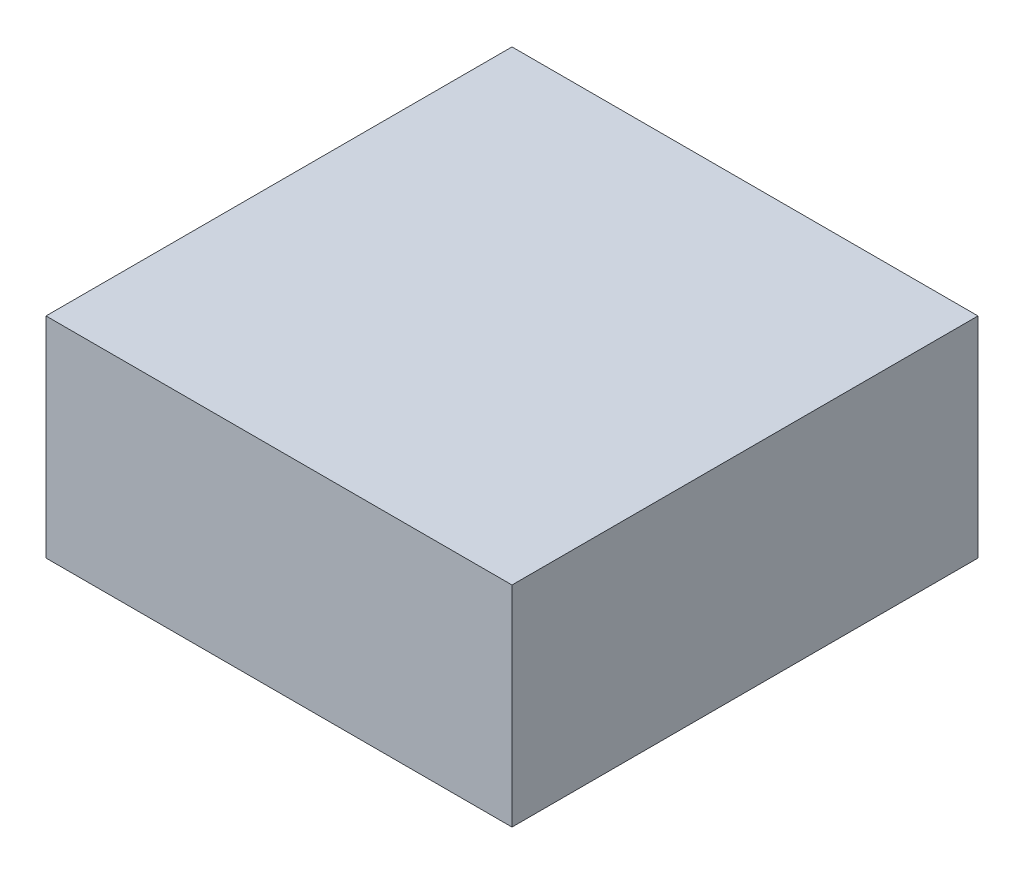
ISO-10303-21;
HEADER;
FILE_DESCRIPTION(('STEP AP214'),'2;1');
FILE_NAME('part.step','',(''),(''),'','','');
FILE_SCHEMA(('AUTOMOTIVE_DESIGN { 1 0 10303 214 1 1 1 1 }'));
ENDSEC;
DATA;
#1=APPLICATION_CONTEXT('core data for automotive mechanical design processes');
#2=APPLICATION_PROTOCOL_DEFINITION('international standard','automotive_design',2000,#1);
#3=PRODUCT_CONTEXT('',#1,'mechanical');
#4=PRODUCT('Part','Part','',(#3));
#5=PRODUCT_RELATED_PRODUCT_CATEGORY('part','',(#4));
#6=PRODUCT_DEFINITION_FORMATION('','',#4);
#7=PRODUCT_DEFINITION_CONTEXT('part definition',#1,'design');
#8=PRODUCT_DEFINITION('design','',#6,#7);
#9=PRODUCT_DEFINITION_SHAPE('','',#8);
#10=(LENGTH_UNIT() NAMED_UNIT(*) SI_UNIT(.MILLI.,.METRE.));
#11=(NAMED_UNIT(*) PLANE_ANGLE_UNIT() SI_UNIT($,.RADIAN.));
#12=(NAMED_UNIT(*) SI_UNIT($,.STERADIAN.) SOLID_ANGLE_UNIT());
#13=UNCERTAINTY_MEASURE_WITH_UNIT(LENGTH_MEASURE(1.E-05),#10,'distance_accuracy_value','');
#14=(GEOMETRIC_REPRESENTATION_CONTEXT(3) GLOBAL_UNCERTAINTY_ASSIGNED_CONTEXT((#13)) GLOBAL_UNIT_ASSIGNED_CONTEXT((#10,
#11,#12)) REPRESENTATION_CONTEXT('',''));
#15=CARTESIAN_POINT('',(0.,0.,0.));
#16=DIRECTION('',(0.,0.,1.));
#17=DIRECTION('',(1.,0.,0.));
#18=AXIS2_PLACEMENT_3D('',#15,#16,#17);
#19=CARTESIAN_POINT('',(0.,0.5,-10.));
#20=DIRECTION('',(0.,1.,0.));
#21=DIRECTION('',(1.,0.,0.));
#22=AXIS2_PLACEMENT_3D('',#19,#20,#21);
#23=PLANE('',#22);
#24=CARTESIAN_POINT('',(0.,0.5,-10.));
#25=DIRECTION('',(0.,1.,0.));
#26=DIRECTION('',(1.,0.,0.));
#27=AXIS2_PLACEMENT_3D('',#24,#25,#26);
#28=CIRCLE('',#27,5.);
#29=CARTESIAN_POINT('',(5.,0.5,-10.));
#30=VERTEX_POINT('',#29);
#31=EDGE_CURVE('E10',#30,#30,#28,.T.);
#32=ORIENTED_EDGE('',*,*,#31,.F.);
#33=EDGE_LOOP('',(#32));
#34=FACE_BOUND('',#33,.T.);
#35=ADVANCED_FACE('F15',(#34),#23,.F.);
#36=CARTESIAN_POINT('',(0.,0.5,-10.));
#37=DIRECTION('',(0.,-1.,0.));
#38=DIRECTION('',(0.,0.,-1.));
#39=AXIS2_PLACEMENT_3D('',#36,#37,#38);
#40=CYLINDRICAL_SURFACE('',#39,5.);
#41=CARTESIAN_POINT('',(0.,-4.5,-10.));
#42=DIRECTION('',(0.,1.,0.));
#43=DIRECTION('',(1.,0.,0.));
#44=AXIS2_PLACEMENT_3D('',#41,#42,#43);
#45=CIRCLE('',#44,5.);
#46=CARTESIAN_POINT('',(5.,-4.5,-10.));
#47=VERTEX_POINT('',#46);
#48=EDGE_CURVE('E104',#47,#47,#45,.T.);
#49=ORIENTED_EDGE('',*,*,#48,.F.);
#50=EDGE_LOOP('',(#49));
#51=FACE_BOUND('',#50,.T.);
#52=ORIENTED_EDGE('',*,*,#31,.T.);
#53=EDGE_LOOP('',(#52));
#54=FACE_BOUND('',#53,.T.);
#55=ADVANCED_FACE('F140',(#51,#54),#40,.F.);
#56=CARTESIAN_POINT('',(0.,0.,0.));
#57=DIRECTION('',(0.,0.,1.));
#58=DIRECTION('',(1.,0.,0.));
#59=AXIS2_PLACEMENT_3D('',#56,#57,#58);
#60=PLANE('',#59);
#61=DIRECTION('',(1.,0.,0.));
#62=VECTOR('',#61,1.);
#63=CARTESIAN_POINT('',(-10.,-4.5,0.));
#64=LINE('',#63,#62);
#65=CARTESIAN_POINT('',(-10.,-4.5,0.));
#66=VERTEX_POINT('',#65);
#67=CARTESIAN_POINT('',(10.,-4.5,0.));
#68=VERTEX_POINT('',#67);
#69=EDGE_CURVE('E97',#66,#68,#64,.T.);
#70=ORIENTED_EDGE('',*,*,#69,.T.);
#71=DIRECTION('',(0.,1.,0.));
#72=VECTOR('',#71,1.);
#73=CARTESIAN_POINT('',(10.,-4.5,0.));
#74=LINE('',#73,#72);
#75=CARTESIAN_POINT('',(10.,4.5,0.));
#76=VERTEX_POINT('',#75);
#77=EDGE_CURVE('E110',#68,#76,#74,.T.);
#78=ORIENTED_EDGE('',*,*,#77,.T.);
#79=DIRECTION('',(-1.,0.,0.));
#80=VECTOR('',#79,1.);
#81=CARTESIAN_POINT('',(10.,4.5,0.));
#82=LINE('',#81,#80);
#83=CARTESIAN_POINT('',(-10.,4.5,0.));
#84=VERTEX_POINT('',#83);
#85=EDGE_CURVE('E117',#76,#84,#82,.T.);
#86=ORIENTED_EDGE('',*,*,#85,.T.);
#87=DIRECTION('',(0.,-1.,0.));
#88=VECTOR('',#87,1.);
#89=CARTESIAN_POINT('',(-10.,4.5,0.));
#90=LINE('',#89,#88);
#91=EDGE_CURVE('E81',#84,#66,#90,.T.);
#92=ORIENTED_EDGE('',*,*,#91,.T.);
#93=EDGE_LOOP('',(#70,#78,#86,#92));
#94=FACE_BOUND('',#93,.T.);
#95=ADVANCED_FACE('F142',(#94),#60,.T.);
#96=CARTESIAN_POINT('',(0.,0.,-20.));
#97=DIRECTION('',(0.,0.,1.));
#98=DIRECTION('',(1.,0.,0.));
#99=AXIS2_PLACEMENT_3D('',#96,#97,#98);
#100=PLANE('',#99);
#101=DIRECTION('',(1.,0.,0.));
#102=VECTOR('',#101,1.);
#103=CARTESIAN_POINT('',(-10.,-4.5,-20.));
#104=LINE('',#103,#102);
#105=CARTESIAN_POINT('',(-10.,-4.5,-20.));
#106=VERTEX_POINT('',#105);
#107=CARTESIAN_POINT('',(10.,-4.5,-20.));
#108=VERTEX_POINT('',#107);
#109=EDGE_CURVE('E84',#106,#108,#104,.T.);
#110=ORIENTED_EDGE('',*,*,#109,.F.);
#111=DIRECTION('',(0.,-1.,0.));
#112=VECTOR('',#111,1.);
#113=CARTESIAN_POINT('',(-10.,4.5,-20.));
#114=LINE('',#113,#112);
#115=CARTESIAN_POINT('',(-10.,4.5,-20.));
#116=VERTEX_POINT('',#115);
#117=EDGE_CURVE('E23',#116,#106,#114,.T.);
#118=ORIENTED_EDGE('',*,*,#117,.F.);
#119=DIRECTION('',(-1.,0.,0.));
#120=VECTOR('',#119,1.);
#121=CARTESIAN_POINT('',(10.,4.5,-20.));
#122=LINE('',#121,#120);
#123=CARTESIAN_POINT('',(10.,4.5,-20.));
#124=VERTEX_POINT('',#123);
#125=EDGE_CURVE('E121',#124,#116,#122,.T.);
#126=ORIENTED_EDGE('',*,*,#125,.F.);
#127=DIRECTION('',(0.,1.,0.));
#128=VECTOR('',#127,1.);
#129=CARTESIAN_POINT('',(10.,-4.5,-20.));
#130=LINE('',#129,#128);
#131=EDGE_CURVE('E87',#108,#124,#130,.T.);
#132=ORIENTED_EDGE('',*,*,#131,.F.);
#133=EDGE_LOOP('',(#110,#118,#126,#132));
#134=FACE_BOUND('',#133,.T.);
#135=ADVANCED_FACE('F85',(#134),#100,.F.);
#136=CARTESIAN_POINT('',(-10.,4.5,-20.));
#137=DIRECTION('',(-1.,0.,0.));
#138=DIRECTION('',(0.,0.,1.));
#139=AXIS2_PLACEMENT_3D('',#136,#137,#138);
#140=PLANE('',#139);
#141=ORIENTED_EDGE('',*,*,#91,.F.);
#142=DIRECTION('',(0.,0.,1.));
#143=VECTOR('',#142,1.);
#144=CARTESIAN_POINT('',(-10.,4.5,-20.));
#145=LINE('',#144,#143);
#146=EDGE_CURVE('E78',#116,#84,#145,.T.);
#147=ORIENTED_EDGE('',*,*,#146,.F.);
#148=ORIENTED_EDGE('',*,*,#117,.T.);
#149=DIRECTION('',(0.,0.,1.));
#150=VECTOR('',#149,1.);
#151=CARTESIAN_POINT('',(-10.,-4.5,-20.));
#152=LINE('',#151,#150);
#153=EDGE_CURVE('E75',#106,#66,#152,.T.);
#154=ORIENTED_EDGE('',*,*,#153,.T.);
#155=EDGE_LOOP('',(#141,#147,#148,#154));
#156=FACE_BOUND('',#155,.T.);
#157=ADVANCED_FACE('F73',(#156),#140,.T.);
#158=CARTESIAN_POINT('',(10.,4.5,-20.));
#159=DIRECTION('',(0.,1.,0.));
#160=DIRECTION('',(1.,0.,0.));
#161=AXIS2_PLACEMENT_3D('',#158,#159,#160);
#162=PLANE('',#161);
#163=ORIENTED_EDGE('',*,*,#85,.F.);
#164=DIRECTION('',(0.,0.,1.));
#165=VECTOR('',#164,1.);
#166=CARTESIAN_POINT('',(10.,4.5,-20.));
#167=LINE('',#166,#165);
#168=EDGE_CURVE('E116',#124,#76,#167,.T.);
#169=ORIENTED_EDGE('',*,*,#168,.F.);
#170=ORIENTED_EDGE('',*,*,#125,.T.);
#171=ORIENTED_EDGE('',*,*,#146,.T.);
#172=EDGE_LOOP('',(#163,#169,#170,#171));
#173=FACE_BOUND('',#172,.T.);
#174=ADVANCED_FACE('F153',(#173),#162,.T.);
#175=CARTESIAN_POINT('',(10.,-4.5,-20.));
#176=DIRECTION('',(1.,0.,0.));
#177=DIRECTION('',(0.,1.,0.));
#178=AXIS2_PLACEMENT_3D('',#175,#176,#177);
#179=PLANE('',#178);
#180=ORIENTED_EDGE('',*,*,#77,.F.);
#181=DIRECTION('',(0.,0.,1.));
#182=VECTOR('',#181,1.);
#183=CARTESIAN_POINT('',(10.,-4.5,-20.));
#184=LINE('',#183,#182);
#185=EDGE_CURVE('E92',#108,#68,#184,.T.);
#186=ORIENTED_EDGE('',*,*,#185,.F.);
#187=ORIENTED_EDGE('',*,*,#131,.T.);
#188=ORIENTED_EDGE('',*,*,#168,.T.);
#189=EDGE_LOOP('',(#180,#186,#187,#188));
#190=FACE_BOUND('',#189,.T.);
#191=ADVANCED_FACE('F156',(#190),#179,.T.);
#192=CARTESIAN_POINT('',(-10.,-4.5,-20.));
#193=DIRECTION('',(0.,-1.,0.));
#194=DIRECTION('',(0.,0.,-1.));
#195=AXIS2_PLACEMENT_3D('',#192,#193,#194);
#196=PLANE('',#195);
#197=ORIENTED_EDGE('',*,*,#69,.F.);
#198=ORIENTED_EDGE('',*,*,#153,.F.);
#199=ORIENTED_EDGE('',*,*,#109,.T.);
#200=ORIENTED_EDGE('',*,*,#185,.T.);
#201=EDGE_LOOP('',(#197,#198,#199,#200));
#202=FACE_BOUND('',#201,.T.);
#203=ORIENTED_EDGE('',*,*,#48,.T.);
#204=EDGE_LOOP('',(#203));
#205=FACE_BOUND('',#204,.T.);
#206=ADVANCED_FACE('F94',(#202,#205),#196,.T.);
#207=CLOSED_SHELL('',(#35,#55,#95,#135,#157,#174,#191,#206));
#208=MANIFOLD_SOLID_BREP('B1',#207);
#209=ADVANCED_BREP_SHAPE_REPRESENTATION('',(#18,#208),#14);
#210=SHAPE_DEFINITION_REPRESENTATION(#9,#209);
ENDSEC;
END-ISO-10303-21;
